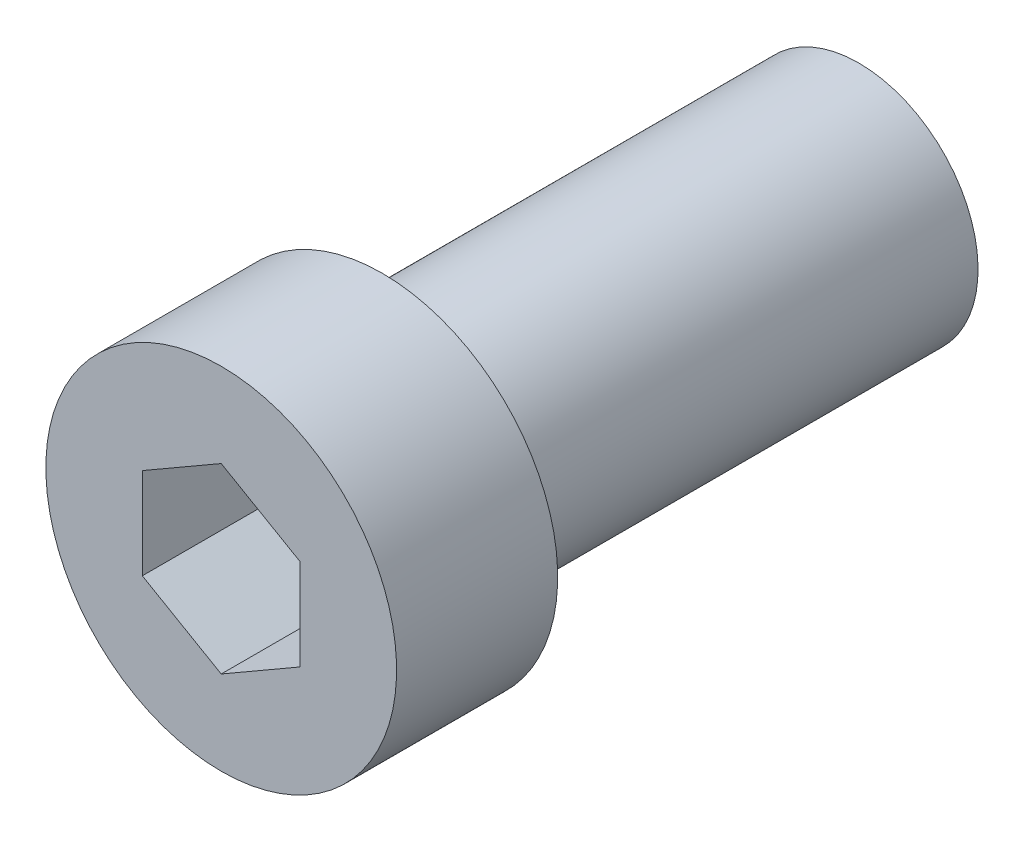
ISO-10303-21;
HEADER;
FILE_DESCRIPTION(('STEP AP214'),'2;1');
FILE_NAME('part.step','',(''),(''),'','','');
FILE_SCHEMA(('AUTOMOTIVE_DESIGN { 1 0 10303 214 1 1 1 1 }'));
ENDSEC;
DATA;
#1=APPLICATION_CONTEXT('core data for automotive mechanical design processes');
#2=APPLICATION_PROTOCOL_DEFINITION('international standard','automotive_design',2000,#1);
#3=PRODUCT_CONTEXT('',#1,'mechanical');
#4=PRODUCT('Part','Part','',(#3));
#5=PRODUCT_RELATED_PRODUCT_CATEGORY('part','',(#4));
#6=PRODUCT_DEFINITION_FORMATION('','',#4);
#7=PRODUCT_DEFINITION_CONTEXT('part definition',#1,'design');
#8=PRODUCT_DEFINITION('design','',#6,#7);
#9=PRODUCT_DEFINITION_SHAPE('','',#8);
#10=(LENGTH_UNIT() NAMED_UNIT(*) SI_UNIT(.MILLI.,.METRE.));
#11=(NAMED_UNIT(*) PLANE_ANGLE_UNIT() SI_UNIT($,.RADIAN.));
#12=(NAMED_UNIT(*) SI_UNIT($,.STERADIAN.) SOLID_ANGLE_UNIT());
#13=UNCERTAINTY_MEASURE_WITH_UNIT(LENGTH_MEASURE(1.E-05),#10,'distance_accuracy_value','');
#14=(GEOMETRIC_REPRESENTATION_CONTEXT(3) GLOBAL_UNCERTAINTY_ASSIGNED_CONTEXT((#13)) GLOBAL_UNIT_ASSIGNED_CONTEXT((#10,
#11,#12)) REPRESENTATION_CONTEXT('',''));
#15=CARTESIAN_POINT('',(0.,0.,0.));
#16=DIRECTION('',(0.,0.,1.));
#17=DIRECTION('',(1.,0.,0.));
#18=AXIS2_PLACEMENT_3D('',#15,#16,#17);
#19=CARTESIAN_POINT('',(0.,0.,2.028));
#20=DIRECTION('',(0.,0.,-1.));
#21=DIRECTION('',(0.,1.,0.));
#22=AXIS2_PLACEMENT_3D('',#19,#20,#21);
#23=CYLINDRICAL_SURFACE('',#22,2.208);
#24=CARTESIAN_POINT('',(0.,0.,2.028));
#25=DIRECTION('',(0.,0.,-1.));
#26=DIRECTION('',(0.,1.,0.));
#27=AXIS2_PLACEMENT_3D('',#24,#25,#26);
#28=CIRCLE('',#27,2.208);
#29=CARTESIAN_POINT('',(0.,2.208,2.028));
#30=VERTEX_POINT('',#29);
#31=EDGE_CURVE('E40',#30,#30,#28,.T.);
#32=ORIENTED_EDGE('',*,*,#31,.T.);
#33=EDGE_LOOP('',(#32));
#34=FACE_BOUND('',#33,.T.);
#35=CARTESIAN_POINT('',(0.,0.,0.));
#36=DIRECTION('',(0.,0.,-1.));
#37=DIRECTION('',(0.,1.,0.));
#38=AXIS2_PLACEMENT_3D('',#35,#36,#37);
#39=CIRCLE('',#38,2.208);
#40=CARTESIAN_POINT('',(0.,2.208,0.));
#41=VERTEX_POINT('',#40);
#42=EDGE_CURVE('E146',#41,#41,#39,.T.);
#43=ORIENTED_EDGE('',*,*,#42,.F.);
#44=EDGE_LOOP('',(#43));
#45=FACE_BOUND('',#44,.T.);
#46=ADVANCED_FACE('F37',(#34,#45),#23,.T.);
#47=CARTESIAN_POINT('',(2.208,0.,2.028));
#48=DIRECTION('',(0.,0.,1.));
#49=DIRECTION('',(0.,-1.,0.));
#50=AXIS2_PLACEMENT_3D('',#47,#48,#49);
#51=PLANE('',#50);
#52=DIRECTION('',(0.866025403784439,0.5,0.));
#53=VECTOR('',#52,1.);
#54=CARTESIAN_POINT('',(0.,-1.14731045493362,2.028));
#55=LINE('',#54,#53);
#56=CARTESIAN_POINT('',(0.,-1.14731045493362,2.028));
#57=VERTEX_POINT('',#56);
#58=CARTESIAN_POINT('',(0.9936,-0.573655227466812,2.028));
#59=VERTEX_POINT('',#58);
#60=EDGE_CURVE('E52',#57,#59,#55,.T.);
#61=ORIENTED_EDGE('',*,*,#60,.F.);
#62=DIRECTION('',(0.866025403784439,-0.5,0.));
#63=VECTOR('',#62,1.);
#64=CARTESIAN_POINT('',(-0.9936,-0.573655227466812,2.028));
#65=LINE('',#64,#63);
#66=CARTESIAN_POINT('',(-0.9936,-0.573655227466812,2.028));
#67=VERTEX_POINT('',#66);
#68=EDGE_CURVE('E135',#67,#57,#65,.T.);
#69=ORIENTED_EDGE('',*,*,#68,.F.);
#70=DIRECTION('',(0.,-1.,0.));
#71=VECTOR('',#70,1.);
#72=CARTESIAN_POINT('',(-0.9936,0.573655227466811,2.028));
#73=LINE('',#72,#71);
#74=CARTESIAN_POINT('',(-0.9936,0.573655227466811,2.028));
#75=VERTEX_POINT('',#74);
#76=EDGE_CURVE('E133',#75,#67,#73,.T.);
#77=ORIENTED_EDGE('',*,*,#76,.F.);
#78=DIRECTION('',(-0.866025403784438,-0.500000000000001,0.));
#79=VECTOR('',#78,1.);
#80=CARTESIAN_POINT('',(0.,1.14731045493362,2.028));
#81=LINE('',#80,#79);
#82=CARTESIAN_POINT('',(0.,1.14731045493362,2.028));
#83=VERTEX_POINT('',#82);
#84=EDGE_CURVE('E100',#83,#75,#81,.T.);
#85=ORIENTED_EDGE('',*,*,#84,.F.);
#86=DIRECTION('',(-0.866025403784438,0.500000000000001,0.));
#87=VECTOR('',#86,1.);
#88=CARTESIAN_POINT('',(0.9936,0.573655227466811,2.028));
#89=LINE('',#88,#87);
#90=CARTESIAN_POINT('',(0.9936,0.573655227466811,2.028));
#91=VERTEX_POINT('',#90);
#92=EDGE_CURVE('E129',#91,#83,#89,.T.);
#93=ORIENTED_EDGE('',*,*,#92,.F.);
#94=DIRECTION('',(0.,1.,0.));
#95=VECTOR('',#94,1.);
#96=CARTESIAN_POINT('',(0.9936,-0.573655227466812,2.028));
#97=LINE('',#96,#95);
#98=EDGE_CURVE('E126',#59,#91,#97,.T.);
#99=ORIENTED_EDGE('',*,*,#98,.F.);
#100=EDGE_LOOP('',(#61,#69,#77,#85,#93,#99));
#101=FACE_BOUND('',#100,.T.);
#102=ORIENTED_EDGE('',*,*,#31,.F.);
#103=EDGE_LOOP('',(#102));
#104=FACE_BOUND('',#103,.T.);
#105=ADVANCED_FACE('F155',(#101,#104),#51,.T.);
#106=CARTESIAN_POINT('',(0.,0.,0.));
#107=DIRECTION('',(0.,0.,-1.));
#108=DIRECTION('',(0.,1.,0.));
#109=AXIS2_PLACEMENT_3D('',#106,#107,#108);
#110=PLANE('',#109);
#111=CARTESIAN_POINT('',(0.,0.,0.));
#112=DIRECTION('',(0.,0.,-1.));
#113=DIRECTION('',(0.,1.,0.));
#114=AXIS2_PLACEMENT_3D('',#111,#112,#113);
#115=CIRCLE('',#114,1.50000000000006);
#116=CARTESIAN_POINT('',(0.,1.50000000000006,0.));
#117=VERTEX_POINT('',#116);
#118=EDGE_CURVE('E11',#117,#117,#115,.T.);
#119=ORIENTED_EDGE('',*,*,#118,.F.);
#120=EDGE_LOOP('',(#119));
#121=FACE_BOUND('',#120,.T.);
#122=ORIENTED_EDGE('',*,*,#42,.T.);
#123=EDGE_LOOP('',(#122));
#124=FACE_BOUND('',#123,.T.);
#125=ADVANCED_FACE('F157',(#121,#124),#110,.T.);
#126=CARTESIAN_POINT('',(0.,0.,-6.));
#127=DIRECTION('',(0.,0.,1.));
#128=DIRECTION('',(0.,-1.,0.));
#129=AXIS2_PLACEMENT_3D('',#126,#127,#128);
#130=CYLINDRICAL_SURFACE('',#129,1.50000000000006);
#131=CARTESIAN_POINT('',(0.,0.,-6.));
#132=DIRECTION('',(0.,0.,-1.));
#133=DIRECTION('',(0.,1.,0.));
#134=AXIS2_PLACEMENT_3D('',#131,#132,#133);
#135=CIRCLE('',#134,1.50000000000006);
#136=CARTESIAN_POINT('',(0.,1.50000000000005,-6.));
#137=VERTEX_POINT('',#136);
#138=EDGE_CURVE('E139',#137,#137,#135,.T.);
#139=ORIENTED_EDGE('',*,*,#138,.F.);
#140=EDGE_LOOP('',(#139));
#141=FACE_BOUND('',#140,.T.);
#142=ORIENTED_EDGE('',*,*,#118,.T.);
#143=EDGE_LOOP('',(#142));
#144=FACE_BOUND('',#143,.T.);
#145=ADVANCED_FACE('F163',(#141,#144),#130,.T.);
#146=CARTESIAN_POINT('',(0.,0.,-6.));
#147=DIRECTION('',(0.,0.,-1.));
#148=DIRECTION('',(0.,1.,0.));
#149=AXIS2_PLACEMENT_3D('',#146,#147,#148);
#150=PLANE('',#149);
#151=ORIENTED_EDGE('',*,*,#138,.T.);
#152=EDGE_LOOP('',(#151));
#153=FACE_BOUND('',#152,.T.);
#154=ADVANCED_FACE('F169',(#153),#150,.T.);
#155=CARTESIAN_POINT('',(0.,-1.14731045493362,0.156));
#156=DIRECTION('',(0.5,-0.866025403784439,0.));
#157=DIRECTION('',(0.866025403784439,0.5,0.));
#158=AXIS2_PLACEMENT_3D('',#155,#156,#157);
#159=PLANE('',#158);
#160=ORIENTED_EDGE('',*,*,#60,.T.);
#161=DIRECTION('',(0.,0.,1.));
#162=VECTOR('',#161,1.);
#163=CARTESIAN_POINT('',(0.9936,-0.573655227466812,0.156));
#164=LINE('',#163,#162);
#165=CARTESIAN_POINT('',(0.9936,-0.573655227466812,0.156));
#166=VERTEX_POINT('',#165);
#167=EDGE_CURVE('E82',#166,#59,#164,.T.);
#168=ORIENTED_EDGE('',*,*,#167,.F.);
#169=DIRECTION('',(0.866025403784439,0.5,0.));
#170=VECTOR('',#169,1.);
#171=CARTESIAN_POINT('',(0.,-1.14731045493362,0.156));
#172=LINE('',#171,#170);
#173=CARTESIAN_POINT('',(0.,-1.14731045493362,0.156));
#174=VERTEX_POINT('',#173);
#175=EDGE_CURVE('E137',#174,#166,#172,.T.);
#176=ORIENTED_EDGE('',*,*,#175,.F.);
#177=DIRECTION('',(0.,0.,1.));
#178=VECTOR('',#177,1.);
#179=CARTESIAN_POINT('',(0.,-1.14731045493362,0.156));
#180=LINE('',#179,#178);
#181=EDGE_CURVE('E60',#174,#57,#180,.T.);
#182=ORIENTED_EDGE('',*,*,#181,.T.);
#183=EDGE_LOOP('',(#160,#168,#176,#182));
#184=FACE_BOUND('',#183,.T.);
#185=ADVANCED_FACE('F173',(#184),#159,.F.);
#186=CARTESIAN_POINT('',(-0.9936,-0.573655227466812,0.156));
#187=DIRECTION('',(-0.5,-0.866025403784439,0.));
#188=DIRECTION('',(0.866025403784439,-0.5,0.));
#189=AXIS2_PLACEMENT_3D('',#186,#187,#188);
#190=PLANE('',#189);
#191=ORIENTED_EDGE('',*,*,#68,.T.);
#192=ORIENTED_EDGE('',*,*,#181,.F.);
#193=DIRECTION('',(0.866025403784439,-0.5,0.));
#194=VECTOR('',#193,1.);
#195=CARTESIAN_POINT('',(-0.9936,-0.573655227466812,0.156));
#196=LINE('',#195,#194);
#197=CARTESIAN_POINT('',(-0.9936,-0.573655227466812,0.156));
#198=VERTEX_POINT('',#197);
#199=EDGE_CURVE('E112',#198,#174,#196,.T.);
#200=ORIENTED_EDGE('',*,*,#199,.F.);
#201=DIRECTION('',(0.,0.,1.));
#202=VECTOR('',#201,1.);
#203=CARTESIAN_POINT('',(-0.9936,-0.573655227466812,0.156));
#204=LINE('',#203,#202);
#205=EDGE_CURVE('E104',#198,#67,#204,.T.);
#206=ORIENTED_EDGE('',*,*,#205,.T.);
#207=EDGE_LOOP('',(#191,#192,#200,#206));
#208=FACE_BOUND('',#207,.T.);
#209=ADVANCED_FACE('F177',(#208),#190,.F.);
#210=CARTESIAN_POINT('',(-0.9936,0.573655227466811,0.156));
#211=DIRECTION('',(-1.,0.,0.));
#212=DIRECTION('',(0.,0.,1.));
#213=AXIS2_PLACEMENT_3D('',#210,#211,#212);
#214=PLANE('',#213);
#215=ORIENTED_EDGE('',*,*,#76,.T.);
#216=ORIENTED_EDGE('',*,*,#205,.F.);
#217=DIRECTION('',(0.,-1.,0.));
#218=VECTOR('',#217,1.);
#219=CARTESIAN_POINT('',(-0.9936,0.573655227466811,0.156));
#220=LINE('',#219,#218);
#221=CARTESIAN_POINT('',(-0.9936,0.573655227466811,0.156));
#222=VERTEX_POINT('',#221);
#223=EDGE_CURVE('E108',#222,#198,#220,.T.);
#224=ORIENTED_EDGE('',*,*,#223,.F.);
#225=DIRECTION('',(0.,0.,1.));
#226=VECTOR('',#225,1.);
#227=CARTESIAN_POINT('',(-0.9936,0.573655227466811,0.156));
#228=LINE('',#227,#226);
#229=EDGE_CURVE('E93',#222,#75,#228,.T.);
#230=ORIENTED_EDGE('',*,*,#229,.T.);
#231=EDGE_LOOP('',(#215,#216,#224,#230));
#232=FACE_BOUND('',#231,.T.);
#233=ADVANCED_FACE('F109',(#232),#214,.F.);
#234=CARTESIAN_POINT('',(0.,1.14731045493362,0.156));
#235=DIRECTION('',(-0.500000000000001,0.866025403784438,0.));
#236=DIRECTION('',(-0.866025403784438,-0.500000000000001,0.));
#237=AXIS2_PLACEMENT_3D('',#234,#235,#236);
#238=PLANE('',#237);
#239=ORIENTED_EDGE('',*,*,#84,.T.);
#240=ORIENTED_EDGE('',*,*,#229,.F.);
#241=DIRECTION('',(-0.866025403784438,-0.500000000000001,0.));
#242=VECTOR('',#241,1.);
#243=CARTESIAN_POINT('',(0.,1.14731045493362,0.156));
#244=LINE('',#243,#242);
#245=CARTESIAN_POINT('',(0.,1.14731045493362,0.156));
#246=VERTEX_POINT('',#245);
#247=EDGE_CURVE('E97',#246,#222,#244,.T.);
#248=ORIENTED_EDGE('',*,*,#247,.F.);
#249=DIRECTION('',(0.,0.,1.));
#250=VECTOR('',#249,1.);
#251=CARTESIAN_POINT('',(0.,1.14731045493362,0.156));
#252=LINE('',#251,#250);
#253=EDGE_CURVE('E105',#246,#83,#252,.T.);
#254=ORIENTED_EDGE('',*,*,#253,.T.);
#255=EDGE_LOOP('',(#239,#240,#248,#254));
#256=FACE_BOUND('',#255,.T.);
#257=ADVANCED_FACE('F95',(#256),#238,.F.);
#258=CARTESIAN_POINT('',(0.9936,0.573655227466811,0.156));
#259=DIRECTION('',(0.500000000000001,0.866025403784438,0.));
#260=DIRECTION('',(-0.866025403784438,0.500000000000001,0.));
#261=AXIS2_PLACEMENT_3D('',#258,#259,#260);
#262=PLANE('',#261);
#263=ORIENTED_EDGE('',*,*,#92,.T.);
#264=ORIENTED_EDGE('',*,*,#253,.F.);
#265=DIRECTION('',(-0.866025403784438,0.500000000000001,0.));
#266=VECTOR('',#265,1.);
#267=CARTESIAN_POINT('',(0.9936,0.573655227466811,0.156));
#268=LINE('',#267,#266);
#269=CARTESIAN_POINT('',(0.9936,0.573655227466811,0.156));
#270=VERTEX_POINT('',#269);
#271=EDGE_CURVE('E118',#270,#246,#268,.T.);
#272=ORIENTED_EDGE('',*,*,#271,.F.);
#273=DIRECTION('',(0.,0.,1.));
#274=VECTOR('',#273,1.);
#275=CARTESIAN_POINT('',(0.9936,0.573655227466811,0.156));
#276=LINE('',#275,#274);
#277=EDGE_CURVE('E142',#270,#91,#276,.T.);
#278=ORIENTED_EDGE('',*,*,#277,.T.);
#279=EDGE_LOOP('',(#263,#264,#272,#278));
#280=FACE_BOUND('',#279,.T.);
#281=ADVANCED_FACE('F181',(#280),#262,.F.);
#282=CARTESIAN_POINT('',(0.9936,-0.573655227466812,0.156));
#283=DIRECTION('',(1.,0.,0.));
#284=DIRECTION('',(0.,0.,-1.));
#285=AXIS2_PLACEMENT_3D('',#282,#283,#284);
#286=PLANE('',#285);
#287=ORIENTED_EDGE('',*,*,#98,.T.);
#288=ORIENTED_EDGE('',*,*,#277,.F.);
#289=DIRECTION('',(0.,1.,0.));
#290=VECTOR('',#289,1.);
#291=CARTESIAN_POINT('',(0.9936,-0.573655227466812,0.156));
#292=LINE('',#291,#290);
#293=EDGE_CURVE('E120',#166,#270,#292,.T.);
#294=ORIENTED_EDGE('',*,*,#293,.F.);
#295=ORIENTED_EDGE('',*,*,#167,.T.);
#296=EDGE_LOOP('',(#287,#288,#294,#295));
#297=FACE_BOUND('',#296,.T.);
#298=ADVANCED_FACE('F178',(#297),#286,.F.);
#299=CARTESIAN_POINT('',(0.,0.,0.156));
#300=DIRECTION('',(0.,0.,1.));
#301=DIRECTION('',(1.,0.,0.));
#302=AXIS2_PLACEMENT_3D('',#299,#300,#301);
#303=PLANE('',#302);
#304=ORIENTED_EDGE('',*,*,#175,.T.);
#305=ORIENTED_EDGE('',*,*,#293,.T.);
#306=ORIENTED_EDGE('',*,*,#271,.T.);
#307=ORIENTED_EDGE('',*,*,#247,.T.);
#308=ORIENTED_EDGE('',*,*,#223,.T.);
#309=ORIENTED_EDGE('',*,*,#199,.T.);
#310=EDGE_LOOP('',(#304,#305,#306,#307,#308,#309));
#311=FACE_BOUND('',#310,.T.);
#312=ADVANCED_FACE('F115',(#311),#303,.T.);
#313=CLOSED_SHELL('',(#46,#105,#125,#145,#154,#185,#209,#233,#257,#281,#298,#312));
#314=MANIFOLD_SOLID_BREP('B2',#313);
#315=ADVANCED_BREP_SHAPE_REPRESENTATION('',(#18,#314),#14);
#316=SHAPE_DEFINITION_REPRESENTATION(#9,#315);
ENDSEC;
END-ISO-10303-21;
